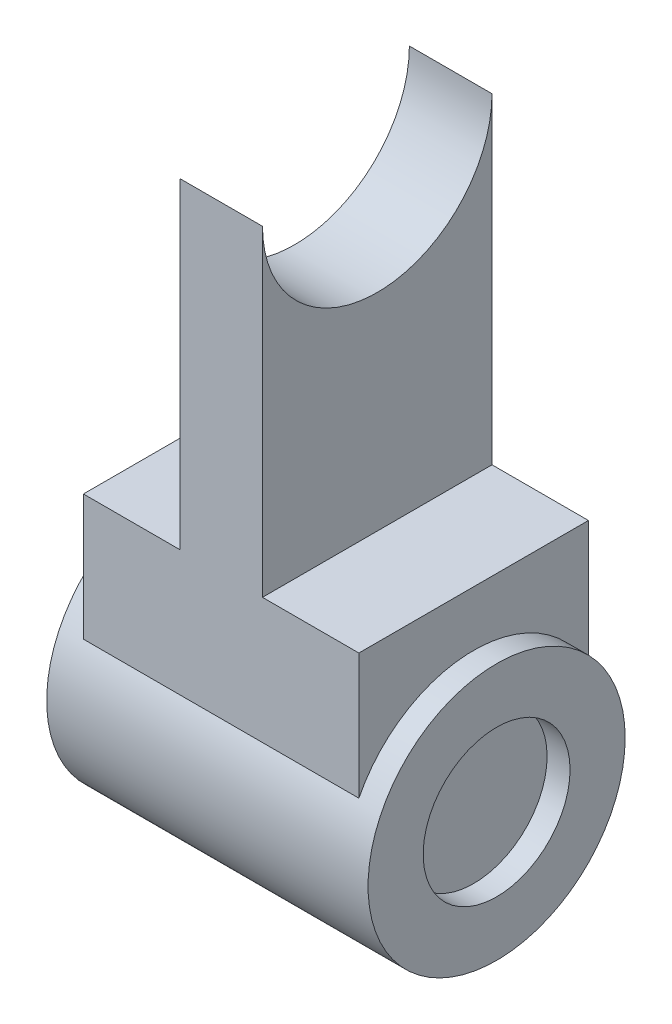
ISO-10303-21;
HEADER;
FILE_DESCRIPTION(('STEP AP214'),'2;1');
FILE_NAME('part.step','',(''),(''),'','','');
FILE_SCHEMA(('AUTOMOTIVE_DESIGN { 1 0 10303 214 1 1 1 1 }'));
ENDSEC;
DATA;
#1=APPLICATION_CONTEXT('core data for automotive mechanical design processes');
#2=APPLICATION_PROTOCOL_DEFINITION('international standard','automotive_design',2000,#1);
#3=PRODUCT_CONTEXT('',#1,'mechanical');
#4=PRODUCT('Part','Part','',(#3));
#5=PRODUCT_RELATED_PRODUCT_CATEGORY('part','',(#4));
#6=PRODUCT_DEFINITION_FORMATION('','',#4);
#7=PRODUCT_DEFINITION_CONTEXT('part definition',#1,'design');
#8=PRODUCT_DEFINITION('design','',#6,#7);
#9=PRODUCT_DEFINITION_SHAPE('','',#8);
#10=(LENGTH_UNIT() NAMED_UNIT(*) SI_UNIT(.MILLI.,.METRE.));
#11=(NAMED_UNIT(*) PLANE_ANGLE_UNIT() SI_UNIT($,.RADIAN.));
#12=(NAMED_UNIT(*) SI_UNIT($,.STERADIAN.) SOLID_ANGLE_UNIT());
#13=UNCERTAINTY_MEASURE_WITH_UNIT(LENGTH_MEASURE(1.E-05),#10,'distance_accuracy_value','');
#14=(GEOMETRIC_REPRESENTATION_CONTEXT(3) GLOBAL_UNCERTAINTY_ASSIGNED_CONTEXT((#13)) GLOBAL_UNIT_ASSIGNED_CONTEXT((#10,
#11,#12)) REPRESENTATION_CONTEXT('',''));
#15=CARTESIAN_POINT('',(0.,0.,0.));
#16=DIRECTION('',(0.,0.,1.));
#17=DIRECTION('',(1.,0.,0.));
#18=AXIS2_PLACEMENT_3D('',#15,#16,#17);
#19=CARTESIAN_POINT('',(30.,40.,25.));
#20=DIRECTION('',(0.,-1.,0.));
#21=DIRECTION('',(0.,0.,-1.));
#22=AXIS2_PLACEMENT_3D('',#19,#20,#21);
#23=PLANE('',#22);
#24=DIRECTION('',(0.,0.,1.));
#25=VECTOR('',#24,1.);
#26=CARTESIAN_POINT('',(-9.,40.,25.));
#27=LINE('',#26,#25);
#28=CARTESIAN_POINT('',(-9.,40.,-25.));
#29=VERTEX_POINT('',#28);
#30=CARTESIAN_POINT('',(-9.,40.,25.));
#31=VERTEX_POINT('',#30);
#32=EDGE_CURVE('E56',#29,#31,#27,.T.);
#33=ORIENTED_EDGE('',*,*,#32,.F.);
#34=DIRECTION('',(-1.,0.,0.));
#35=VECTOR('',#34,1.);
#36=CARTESIAN_POINT('',(30.,40.,-25.));
#37=LINE('',#36,#35);
#38=CARTESIAN_POINT('',(-30.,40.,-25.));
#39=VERTEX_POINT('',#38);
#40=EDGE_CURVE('E165',#29,#39,#37,.T.);
#41=ORIENTED_EDGE('',*,*,#40,.T.);
#42=DIRECTION('',(0.,0.,1.));
#43=VECTOR('',#42,1.);
#44=CARTESIAN_POINT('',(-30.,40.,25.));
#45=LINE('',#44,#43);
#46=CARTESIAN_POINT('',(-30.,40.,25.));
#47=VERTEX_POINT('',#46);
#48=EDGE_CURVE('E153',#39,#47,#45,.T.);
#49=ORIENTED_EDGE('',*,*,#48,.T.);
#50=DIRECTION('',(-1.,0.,0.));
#51=VECTOR('',#50,1.);
#52=CARTESIAN_POINT('',(30.,40.,25.));
#53=LINE('',#52,#51);
#54=EDGE_CURVE('E161',#31,#47,#53,.T.);
#55=ORIENTED_EDGE('',*,*,#54,.F.);
#56=EDGE_LOOP('',(#33,#41,#49,#55));
#57=FACE_BOUND('',#56,.T.);
#58=ADVANCED_FACE('F41',(#57),#23,.F.);
#59=CARTESIAN_POINT('',(35.,0.,0.));
#60=DIRECTION('',(-1.,0.,0.));
#61=DIRECTION('',(0.,0.,1.));
#62=AXIS2_PLACEMENT_3D('',#59,#60,#61);
#63=CYLINDRICAL_SURFACE('',#62,16.);
#64=CARTESIAN_POINT('',(-35.,0.,0.));
#65=DIRECTION('',(1.,0.,0.));
#66=DIRECTION('',(0.,0.,-1.));
#67=AXIS2_PLACEMENT_3D('',#64,#65,#66);
#68=CIRCLE('',#67,16.);
#69=CARTESIAN_POINT('',(-35.,0.,-16.));
#70=VERTEX_POINT('',#69);
#71=EDGE_CURVE('E173',#70,#70,#68,.T.);
#72=ORIENTED_EDGE('',*,*,#71,.F.);
#73=EDGE_LOOP('',(#72));
#74=FACE_BOUND('',#73,.T.);
#75=CARTESIAN_POINT('',(-30.,0.,0.));
#76=DIRECTION('',(1.,0.,0.));
#77=DIRECTION('',(0.,0.,-1.));
#78=AXIS2_PLACEMENT_3D('',#75,#76,#77);
#79=CIRCLE('',#78,16.);
#80=CARTESIAN_POINT('',(-30.,0.,-16.));
#81=VERTEX_POINT('',#80);
#82=EDGE_CURVE('E167',#81,#81,#79,.T.);
#83=ORIENTED_EDGE('',*,*,#82,.T.);
#84=EDGE_LOOP('',(#83));
#85=FACE_BOUND('',#84,.T.);
#86=ADVANCED_FACE('F186',(#74,#85),#63,.F.);
#87=CARTESIAN_POINT('',(35.,0.,0.));
#88=DIRECTION('',(1.,0.,0.));
#89=DIRECTION('',(0.,0.,-1.));
#90=AXIS2_PLACEMENT_3D('',#87,#88,#89);
#91=PLANE('',#90);
#92=CARTESIAN_POINT('',(35.,0.,0.));
#93=DIRECTION('',(1.,0.,0.));
#94=DIRECTION('',(0.,0.,-1.));
#95=AXIS2_PLACEMENT_3D('',#92,#93,#94);
#96=CIRCLE('',#95,28.);
#97=CARTESIAN_POINT('',(35.,0.,-28.));
#98=VERTEX_POINT('',#97);
#99=EDGE_CURVE('E49',#98,#98,#96,.T.);
#100=ORIENTED_EDGE('',*,*,#99,.T.);
#101=EDGE_LOOP('',(#100));
#102=FACE_BOUND('',#101,.T.);
#103=CARTESIAN_POINT('',(35.,0.,0.));
#104=DIRECTION('',(1.,0.,0.));
#105=DIRECTION('',(0.,0.,-1.));
#106=AXIS2_PLACEMENT_3D('',#103,#104,#105);
#107=CIRCLE('',#106,16.);
#108=CARTESIAN_POINT('',(35.,0.,-16.));
#109=VERTEX_POINT('',#108);
#110=EDGE_CURVE('E174',#109,#109,#107,.T.);
#111=ORIENTED_EDGE('',*,*,#110,.F.);
#112=EDGE_LOOP('',(#111));
#113=FACE_BOUND('',#112,.T.);
#114=ADVANCED_FACE('F212',(#102,#113),#91,.T.);
#115=CARTESIAN_POINT('',(-35.,0.,0.));
#116=DIRECTION('',(1.,0.,0.));
#117=DIRECTION('',(0.,0.,-1.));
#118=AXIS2_PLACEMENT_3D('',#115,#116,#117);
#119=PLANE('',#118);
#120=CARTESIAN_POINT('',(-35.,0.,0.));
#121=DIRECTION('',(1.,0.,0.));
#122=DIRECTION('',(0.,0.,-1.));
#123=AXIS2_PLACEMENT_3D('',#120,#121,#122);
#124=CIRCLE('',#123,28.);
#125=CARTESIAN_POINT('',(-35.,0.,-28.));
#126=VERTEX_POINT('',#125);
#127=EDGE_CURVE('E177',#126,#126,#124,.T.);
#128=ORIENTED_EDGE('',*,*,#127,.F.);
#129=EDGE_LOOP('',(#128));
#130=FACE_BOUND('',#129,.T.);
#131=ORIENTED_EDGE('',*,*,#71,.T.);
#132=EDGE_LOOP('',(#131));
#133=FACE_BOUND('',#132,.T.);
#134=ADVANCED_FACE('F226',(#130,#133),#119,.F.);
#135=CARTESIAN_POINT('',(35.,0.,0.));
#136=DIRECTION('',(-1.,0.,0.));
#137=DIRECTION('',(0.,0.,1.));
#138=AXIS2_PLACEMENT_3D('',#135,#136,#137);
#139=CYLINDRICAL_SURFACE('',#138,28.);
#140=CARTESIAN_POINT('',(30.,0.,0.));
#141=DIRECTION('',(1.,0.,0.));
#142=DIRECTION('',(0.,0.,-1.));
#143=AXIS2_PLACEMENT_3D('',#140,#141,#142);
#144=CIRCLE('',#143,28.);
#145=CARTESIAN_POINT('',(30.,12.6095202129185,-25.));
#146=VERTEX_POINT('',#145);
#147=CARTESIAN_POINT('',(30.,12.6095202129185,25.));
#148=VERTEX_POINT('',#147);
#149=EDGE_CURVE('E171',#146,#148,#144,.T.);
#150=ORIENTED_EDGE('',*,*,#149,.T.);
#151=DIRECTION('',(-1.,0.,0.));
#152=VECTOR('',#151,1.);
#153=CARTESIAN_POINT('',(30.,12.6095202129185,25.));
#154=LINE('',#153,#152);
#155=CARTESIAN_POINT('',(-30.,12.6095202129185,25.));
#156=VERTEX_POINT('',#155);
#157=EDGE_CURVE('E159',#148,#156,#154,.T.);
#158=ORIENTED_EDGE('',*,*,#157,.T.);
#159=CARTESIAN_POINT('',(-30.,0.,0.));
#160=DIRECTION('',(1.,0.,0.));
#161=DIRECTION('',(0.,0.,-1.));
#162=AXIS2_PLACEMENT_3D('',#159,#160,#161);
#163=CIRCLE('',#162,28.);
#164=CARTESIAN_POINT('',(-30.,12.6095202129185,-25.));
#165=VERTEX_POINT('',#164);
#166=EDGE_CURVE('E168',#165,#156,#163,.T.);
#167=ORIENTED_EDGE('',*,*,#166,.F.);
#168=DIRECTION('',(-1.,0.,0.));
#169=VECTOR('',#168,1.);
#170=CARTESIAN_POINT('',(30.,12.6095202129185,-25.));
#171=LINE('',#170,#169);
#172=EDGE_CURVE('E150',#146,#165,#171,.T.);
#173=ORIENTED_EDGE('',*,*,#172,.F.);
#174=EDGE_LOOP('',(#150,#158,#167,#173));
#175=FACE_BOUND('',#174,.T.);
#176=ORIENTED_EDGE('',*,*,#99,.F.);
#177=EDGE_LOOP('',(#176));
#178=FACE_BOUND('',#177,.T.);
#179=ORIENTED_EDGE('',*,*,#127,.T.);
#180=EDGE_LOOP('',(#179));
#181=FACE_BOUND('',#180,.T.);
#182=ADVANCED_FACE('F43',(#175,#178,#181),#139,.T.);
#183=CARTESIAN_POINT('',(30.,0.,0.));
#184=DIRECTION('',(1.,0.,0.));
#185=DIRECTION('',(0.,0.,-1.));
#186=AXIS2_PLACEMENT_3D('',#183,#184,#185);
#187=CIRCLE('',#186,16.);
#188=CARTESIAN_POINT('',(30.,0.,-16.));
#189=VERTEX_POINT('',#188);
#190=EDGE_CURVE('E11',#189,#189,#187,.T.);
#191=ORIENTED_EDGE('',*,*,#190,.F.);
#192=EDGE_LOOP('',(#191));
#193=FACE_BOUND('',#192,.T.);
#194=ORIENTED_EDGE('',*,*,#110,.T.);
#195=EDGE_LOOP('',(#194));
#196=FACE_BOUND('',#195,.T.);
#197=ADVANCED_FACE('F191',(#193,#196),#63,.F.);
#198=CARTESIAN_POINT('',(-30.,0.,0.));
#199=DIRECTION('',(1.,0.,0.));
#200=DIRECTION('',(0.,0.,-1.));
#201=AXIS2_PLACEMENT_3D('',#198,#199,#200);
#202=PLANE('',#201);
#203=ORIENTED_EDGE('',*,*,#82,.F.);
#204=EDGE_LOOP('',(#203));
#205=FACE_BOUND('',#204,.T.);
#206=ADVANCED_FACE('F188',(#205),#202,.F.);
#207=CARTESIAN_POINT('',(30.,0.,0.));
#208=DIRECTION('',(1.,0.,0.));
#209=DIRECTION('',(0.,0.,-1.));
#210=AXIS2_PLACEMENT_3D('',#207,#208,#209);
#211=PLANE('',#210);
#212=ORIENTED_EDGE('',*,*,#190,.T.);
#213=EDGE_LOOP('',(#212));
#214=FACE_BOUND('',#213,.T.);
#215=ADVANCED_FACE('F190',(#214),#211,.T.);
#216=CARTESIAN_POINT('',(30.,40.,-25.));
#217=DIRECTION('',(0.,0.,1.));
#218=DIRECTION('',(1.,0.,0.));
#219=AXIS2_PLACEMENT_3D('',#216,#217,#218);
#220=PLANE('',#219);
#221=ORIENTED_EDGE('',*,*,#172,.T.);
#222=DIRECTION('',(0.,1.,0.));
#223=VECTOR('',#222,1.);
#224=CARTESIAN_POINT('',(-30.,40.,-25.));
#225=LINE('',#224,#223);
#226=EDGE_CURVE('E140',#165,#39,#225,.T.);
#227=ORIENTED_EDGE('',*,*,#226,.T.);
#228=ORIENTED_EDGE('',*,*,#40,.F.);
#229=DIRECTION('',(0.,1.,0.));
#230=VECTOR('',#229,1.);
#231=CARTESIAN_POINT('',(-9.,40.,-25.));
#232=LINE('',#231,#230);
#233=CARTESIAN_POINT('',(-9.,110.,-25.));
#234=VERTEX_POINT('',#233);
#235=EDGE_CURVE('E121',#29,#234,#232,.T.);
#236=ORIENTED_EDGE('',*,*,#235,.T.);
#237=DIRECTION('',(-1.,0.,0.));
#238=VECTOR('',#237,1.);
#239=CARTESIAN_POINT('',(9.,110.,-25.));
#240=LINE('',#239,#238);
#241=CARTESIAN_POINT('',(9.,110.,-25.));
#242=VERTEX_POINT('',#241);
#243=EDGE_CURVE('E118',#242,#234,#240,.T.);
#244=ORIENTED_EDGE('',*,*,#243,.F.);
#245=DIRECTION('',(0.,1.,0.));
#246=VECTOR('',#245,1.);
#247=CARTESIAN_POINT('',(9.,12.6095202129185,-25.));
#248=LINE('',#247,#246);
#249=CARTESIAN_POINT('',(9.,40.,-25.));
#250=VERTEX_POINT('',#249);
#251=EDGE_CURVE('E106',#250,#242,#248,.T.);
#252=ORIENTED_EDGE('',*,*,#251,.F.);
#253=CARTESIAN_POINT('',(30.,40.,-25.));
#254=VERTEX_POINT('',#253);
#255=EDGE_CURVE('E64',#254,#250,#37,.T.);
#256=ORIENTED_EDGE('',*,*,#255,.F.);
#257=DIRECTION('',(0.,1.,0.));
#258=VECTOR('',#257,1.);
#259=CARTESIAN_POINT('',(30.,40.,-25.));
#260=LINE('',#259,#258);
#261=EDGE_CURVE('E141',#146,#254,#260,.T.);
#262=ORIENTED_EDGE('',*,*,#261,.F.);
#263=EDGE_LOOP('',(#221,#227,#228,#236,#244,#252,#256,#262));
#264=FACE_BOUND('',#263,.T.);
#265=ADVANCED_FACE('F119',(#264),#220,.F.);
#266=ORIENTED_EDGE('',*,*,#255,.T.);
#267=DIRECTION('',(0.,0.,1.));
#268=VECTOR('',#267,1.);
#269=CARTESIAN_POINT('',(9.,40.,25.));
#270=LINE('',#269,#268);
#271=CARTESIAN_POINT('',(9.,40.,25.));
#272=VERTEX_POINT('',#271);
#273=EDGE_CURVE('E113',#250,#272,#270,.T.);
#274=ORIENTED_EDGE('',*,*,#273,.T.);
#275=CARTESIAN_POINT('',(30.,40.,25.));
#276=VERTEX_POINT('',#275);
#277=EDGE_CURVE('E162',#276,#272,#53,.T.);
#278=ORIENTED_EDGE('',*,*,#277,.F.);
#279=DIRECTION('',(0.,0.,1.));
#280=VECTOR('',#279,1.);
#281=CARTESIAN_POINT('',(30.,40.,25.));
#282=LINE('',#281,#280);
#283=EDGE_CURVE('E144',#254,#276,#282,.T.);
#284=ORIENTED_EDGE('',*,*,#283,.F.);
#285=EDGE_LOOP('',(#266,#274,#278,#284));
#286=FACE_BOUND('',#285,.T.);
#287=ADVANCED_FACE('F208',(#286),#23,.F.);
#288=CARTESIAN_POINT('',(30.,40.,25.));
#289=DIRECTION('',(0.,0.,-1.));
#290=DIRECTION('',(-1.,0.,0.));
#291=AXIS2_PLACEMENT_3D('',#288,#289,#290);
#292=PLANE('',#291);
#293=ORIENTED_EDGE('',*,*,#277,.T.);
#294=DIRECTION('',(0.,-1.,0.));
#295=VECTOR('',#294,1.);
#296=CARTESIAN_POINT('',(9.,40.,25.));
#297=LINE('',#296,#295);
#298=CARTESIAN_POINT('',(9.,110.,25.));
#299=VERTEX_POINT('',#298);
#300=EDGE_CURVE('E115',#299,#272,#297,.T.);
#301=ORIENTED_EDGE('',*,*,#300,.F.);
#302=DIRECTION('',(-1.,0.,0.));
#303=VECTOR('',#302,1.);
#304=CARTESIAN_POINT('',(9.,110.,25.));
#305=LINE('',#304,#303);
#306=CARTESIAN_POINT('',(-9.,110.,25.));
#307=VERTEX_POINT('',#306);
#308=EDGE_CURVE('E124',#299,#307,#305,.T.);
#309=ORIENTED_EDGE('',*,*,#308,.T.);
#310=DIRECTION('',(0.,-1.,0.));
#311=VECTOR('',#310,1.);
#312=CARTESIAN_POINT('',(-9.,40.,25.));
#313=LINE('',#312,#311);
#314=EDGE_CURVE('E135',#307,#31,#313,.T.);
#315=ORIENTED_EDGE('',*,*,#314,.T.);
#316=ORIENTED_EDGE('',*,*,#54,.T.);
#317=DIRECTION('',(0.,-1.,0.));
#318=VECTOR('',#317,1.);
#319=CARTESIAN_POINT('',(-30.,40.,25.));
#320=LINE('',#319,#318);
#321=EDGE_CURVE('E145',#47,#156,#320,.T.);
#322=ORIENTED_EDGE('',*,*,#321,.T.);
#323=ORIENTED_EDGE('',*,*,#157,.F.);
#324=DIRECTION('',(0.,-1.,0.));
#325=VECTOR('',#324,1.);
#326=CARTESIAN_POINT('',(30.,40.,25.));
#327=LINE('',#326,#325);
#328=EDGE_CURVE('E147',#276,#148,#327,.T.);
#329=ORIENTED_EDGE('',*,*,#328,.F.);
#330=EDGE_LOOP('',(#293,#301,#309,#315,#316,#322,#323,#329));
#331=FACE_BOUND('',#330,.T.);
#332=ADVANCED_FACE('F216',(#331),#292,.F.);
#333=ORIENTED_EDGE('',*,*,#149,.F.);
#334=ORIENTED_EDGE('',*,*,#261,.T.);
#335=ORIENTED_EDGE('',*,*,#283,.T.);
#336=ORIENTED_EDGE('',*,*,#328,.T.);
#337=EDGE_LOOP('',(#333,#334,#335,#336));
#338=FACE_BOUND('',#337,.T.);
#339=ADVANCED_FACE('F200',(#338),#211,.T.);
#340=ORIENTED_EDGE('',*,*,#226,.F.);
#341=ORIENTED_EDGE('',*,*,#166,.T.);
#342=ORIENTED_EDGE('',*,*,#321,.F.);
#343=ORIENTED_EDGE('',*,*,#48,.F.);
#344=EDGE_LOOP('',(#340,#341,#342,#343));
#345=FACE_BOUND('',#344,.T.);
#346=ADVANCED_FACE('F193',(#345),#202,.F.);
#347=CARTESIAN_POINT('',(9.,0.,0.));
#348=DIRECTION('',(1.,0.,0.));
#349=DIRECTION('',(0.,0.,-1.));
#350=AXIS2_PLACEMENT_3D('',#347,#348,#349);
#351=PLANE('',#350);
#352=ORIENTED_EDGE('',*,*,#273,.F.);
#353=ORIENTED_EDGE('',*,*,#251,.T.);
#354=CARTESIAN_POINT('',(9.,110.,0.));
#355=DIRECTION('',(-1.,0.,0.));
#356=DIRECTION('',(0.,0.,-1.));
#357=AXIS2_PLACEMENT_3D('',#354,#355,#356);
#358=CIRCLE('',#357,25.);
#359=EDGE_CURVE('E111',#242,#299,#358,.T.);
#360=ORIENTED_EDGE('',*,*,#359,.T.);
#361=ORIENTED_EDGE('',*,*,#300,.T.);
#362=EDGE_LOOP('',(#352,#353,#360,#361));
#363=FACE_BOUND('',#362,.T.);
#364=ADVANCED_FACE('F108',(#363),#351,.T.);
#365=CARTESIAN_POINT('',(-9.,0.,0.));
#366=DIRECTION('',(1.,0.,0.));
#367=DIRECTION('',(0.,0.,-1.));
#368=AXIS2_PLACEMENT_3D('',#365,#366,#367);
#369=PLANE('',#368);
#370=ORIENTED_EDGE('',*,*,#235,.F.);
#371=ORIENTED_EDGE('',*,*,#32,.T.);
#372=ORIENTED_EDGE('',*,*,#314,.F.);
#373=CARTESIAN_POINT('',(-9.,110.,0.));
#374=DIRECTION('',(-1.,0.,0.));
#375=DIRECTION('',(0.,0.,-1.));
#376=AXIS2_PLACEMENT_3D('',#373,#374,#375);
#377=CIRCLE('',#376,25.);
#378=EDGE_CURVE('E133',#234,#307,#377,.T.);
#379=ORIENTED_EDGE('',*,*,#378,.F.);
#380=EDGE_LOOP('',(#370,#371,#372,#379));
#381=FACE_BOUND('',#380,.T.);
#382=ADVANCED_FACE('F256',(#381),#369,.F.);
#383=CARTESIAN_POINT('',(9.,110.,0.));
#384=DIRECTION('',(-1.,0.,0.));
#385=DIRECTION('',(0.,0.,1.));
#386=AXIS2_PLACEMENT_3D('',#383,#384,#385);
#387=CYLINDRICAL_SURFACE('',#386,25.);
#388=ORIENTED_EDGE('',*,*,#378,.T.);
#389=ORIENTED_EDGE('',*,*,#308,.F.);
#390=ORIENTED_EDGE('',*,*,#359,.F.);
#391=ORIENTED_EDGE('',*,*,#243,.T.);
#392=EDGE_LOOP('',(#388,#389,#390,#391));
#393=FACE_BOUND('',#392,.T.);
#394=ADVANCED_FACE('F126',(#393),#387,.F.);
#395=CLOSED_SHELL('',(#58,#86,#114,#134,#182,#197,#206,#215,#265,#287,#332,#339,#346,#364,#382,#394));
#396=MANIFOLD_SOLID_BREP('B2',#395);
#397=ADVANCED_BREP_SHAPE_REPRESENTATION('',(#18,#396),#14);
#398=SHAPE_DEFINITION_REPRESENTATION(#9,#397);
ENDSEC;
END-ISO-10303-21;
